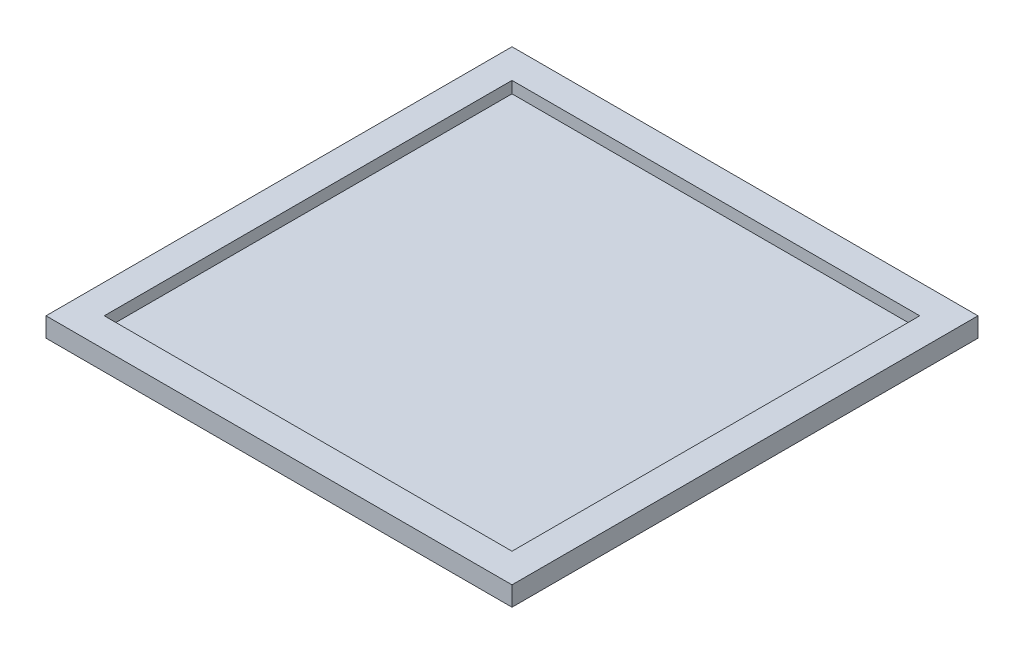
ISO-10303-21;
HEADER;
FILE_DESCRIPTION(('STEP AP214'),'2;1');
FILE_NAME('part.step','',(''),(''),'','','');
FILE_SCHEMA(('AUTOMOTIVE_DESIGN { 1 0 10303 214 1 1 1 1 }'));
ENDSEC;
DATA;
#1=APPLICATION_CONTEXT('core data for automotive mechanical design processes');
#2=APPLICATION_PROTOCOL_DEFINITION('international standard','automotive_design',2000,#1);
#3=PRODUCT_CONTEXT('',#1,'mechanical');
#4=PRODUCT('Part','Part','',(#3));
#5=PRODUCT_RELATED_PRODUCT_CATEGORY('part','',(#4));
#6=PRODUCT_DEFINITION_FORMATION('','',#4);
#7=PRODUCT_DEFINITION_CONTEXT('part definition',#1,'design');
#8=PRODUCT_DEFINITION('design','',#6,#7);
#9=PRODUCT_DEFINITION_SHAPE('','',#8);
#10=(LENGTH_UNIT() NAMED_UNIT(*) SI_UNIT(.MILLI.,.METRE.));
#11=(NAMED_UNIT(*) PLANE_ANGLE_UNIT() SI_UNIT($,.RADIAN.));
#12=(NAMED_UNIT(*) SI_UNIT($,.STERADIAN.) SOLID_ANGLE_UNIT());
#13=UNCERTAINTY_MEASURE_WITH_UNIT(LENGTH_MEASURE(1.E-05),#10,'distance_accuracy_value','');
#14=(GEOMETRIC_REPRESENTATION_CONTEXT(3) GLOBAL_UNCERTAINTY_ASSIGNED_CONTEXT((#13)) GLOBAL_UNIT_ASSIGNED_CONTEXT((#10,
#11,#12)) REPRESENTATION_CONTEXT('',''));
#15=CARTESIAN_POINT('',(0.,0.,0.));
#16=DIRECTION('',(0.,0.,1.));
#17=DIRECTION('',(1.,0.,0.));
#18=AXIS2_PLACEMENT_3D('',#15,#16,#17);
#19=CARTESIAN_POINT('',(60.,5.,60.));
#20=DIRECTION('',(-1.,0.,0.));
#21=DIRECTION('',(0.,0.,1.));
#22=AXIS2_PLACEMENT_3D('',#19,#20,#21);
#23=PLANE('',#22);
#24=DIRECTION('',(0.,0.,-1.));
#25=VECTOR('',#24,1.);
#26=CARTESIAN_POINT('',(60.,0.,60.));
#27=LINE('',#26,#25);
#28=CARTESIAN_POINT('',(60.,0.,60.));
#29=VERTEX_POINT('',#28);
#30=CARTESIAN_POINT('',(60.,0.,-60.));
#31=VERTEX_POINT('',#30);
#32=EDGE_CURVE('E164',#29,#31,#27,.T.);
#33=ORIENTED_EDGE('',*,*,#32,.T.);
#34=DIRECTION('',(0.,-1.,0.));
#35=VECTOR('',#34,1.);
#36=CARTESIAN_POINT('',(60.,5.,-60.));
#37=LINE('',#36,#35);
#38=CARTESIAN_POINT('',(60.,5.,-60.));
#39=VERTEX_POINT('',#38);
#40=EDGE_CURVE('E11',#39,#31,#37,.T.);
#41=ORIENTED_EDGE('',*,*,#40,.F.);
#42=DIRECTION('',(0.,0.,-1.));
#43=VECTOR('',#42,1.);
#44=CARTESIAN_POINT('',(60.,5.,60.));
#45=LINE('',#44,#43);
#46=CARTESIAN_POINT('',(60.,5.,60.));
#47=VERTEX_POINT('',#46);
#48=EDGE_CURVE('E170',#47,#39,#45,.T.);
#49=ORIENTED_EDGE('',*,*,#48,.F.);
#50=DIRECTION('',(0.,-1.,0.));
#51=VECTOR('',#50,1.);
#52=CARTESIAN_POINT('',(60.,5.,60.));
#53=LINE('',#52,#51);
#54=EDGE_CURVE('E180',#47,#29,#53,.T.);
#55=ORIENTED_EDGE('',*,*,#54,.T.);
#56=EDGE_LOOP('',(#33,#41,#49,#55));
#57=FACE_BOUND('',#56,.T.);
#58=ADVANCED_FACE('F45',(#57),#23,.F.);
#59=CARTESIAN_POINT('',(-60.,5.,-60.));
#60=DIRECTION('',(0.,0.,1.));
#61=DIRECTION('',(1.,0.,0.));
#62=AXIS2_PLACEMENT_3D('',#59,#60,#61);
#63=PLANE('',#62);
#64=DIRECTION('',(-1.,0.,0.));
#65=VECTOR('',#64,1.);
#66=CARTESIAN_POINT('',(-60.,0.,-60.));
#67=LINE('',#66,#65);
#68=CARTESIAN_POINT('',(-60.,0.,-60.));
#69=VERTEX_POINT('',#68);
#70=EDGE_CURVE('E184',#31,#69,#67,.T.);
#71=ORIENTED_EDGE('',*,*,#70,.T.);
#72=DIRECTION('',(0.,-1.,0.));
#73=VECTOR('',#72,1.);
#74=CARTESIAN_POINT('',(-60.,5.,-60.));
#75=LINE('',#74,#73);
#76=CARTESIAN_POINT('',(-60.,5.,-60.));
#77=VERTEX_POINT('',#76);
#78=EDGE_CURVE('E53',#77,#69,#75,.T.);
#79=ORIENTED_EDGE('',*,*,#78,.F.);
#80=DIRECTION('',(-1.,0.,0.));
#81=VECTOR('',#80,1.);
#82=CARTESIAN_POINT('',(-60.,5.,-60.));
#83=LINE('',#82,#81);
#84=EDGE_CURVE('E97',#39,#77,#83,.T.);
#85=ORIENTED_EDGE('',*,*,#84,.F.);
#86=ORIENTED_EDGE('',*,*,#40,.T.);
#87=EDGE_LOOP('',(#71,#79,#85,#86));
#88=FACE_BOUND('',#87,.T.);
#89=ADVANCED_FACE('F220',(#88),#63,.F.);
#90=CARTESIAN_POINT('',(-60.,5.,60.));
#91=DIRECTION('',(1.,0.,0.));
#92=DIRECTION('',(0.,0.,-1.));
#93=AXIS2_PLACEMENT_3D('',#90,#91,#92);
#94=PLANE('',#93);
#95=DIRECTION('',(0.,0.,1.));
#96=VECTOR('',#95,1.);
#97=CARTESIAN_POINT('',(-60.,0.,60.));
#98=LINE('',#97,#96);
#99=CARTESIAN_POINT('',(-60.,0.,60.));
#100=VERTEX_POINT('',#99);
#101=EDGE_CURVE('E187',#69,#100,#98,.T.);
#102=ORIENTED_EDGE('',*,*,#101,.T.);
#103=DIRECTION('',(0.,-1.,0.));
#104=VECTOR('',#103,1.);
#105=CARTESIAN_POINT('',(-60.,5.,60.));
#106=LINE('',#105,#104);
#107=CARTESIAN_POINT('',(-60.,5.,60.));
#108=VERTEX_POINT('',#107);
#109=EDGE_CURVE('E194',#108,#100,#106,.T.);
#110=ORIENTED_EDGE('',*,*,#109,.F.);
#111=DIRECTION('',(0.,0.,1.));
#112=VECTOR('',#111,1.);
#113=CARTESIAN_POINT('',(-60.,5.,60.));
#114=LINE('',#113,#112);
#115=EDGE_CURVE('E175',#77,#108,#114,.T.);
#116=ORIENTED_EDGE('',*,*,#115,.F.);
#117=ORIENTED_EDGE('',*,*,#78,.T.);
#118=EDGE_LOOP('',(#102,#110,#116,#117));
#119=FACE_BOUND('',#118,.T.);
#120=ADVANCED_FACE('F201',(#119),#94,.F.);
#121=CARTESIAN_POINT('',(-60.,5.,60.));
#122=DIRECTION('',(0.,0.,-1.));
#123=DIRECTION('',(-1.,0.,0.));
#124=AXIS2_PLACEMENT_3D('',#121,#122,#123);
#125=PLANE('',#124);
#126=DIRECTION('',(1.,0.,0.));
#127=VECTOR('',#126,1.);
#128=CARTESIAN_POINT('',(-60.,0.,60.));
#129=LINE('',#128,#127);
#130=EDGE_CURVE('E90',#100,#29,#129,.T.);
#131=ORIENTED_EDGE('',*,*,#130,.T.);
#132=ORIENTED_EDGE('',*,*,#54,.F.);
#133=DIRECTION('',(1.,0.,0.));
#134=VECTOR('',#133,1.);
#135=CARTESIAN_POINT('',(-60.,5.,60.));
#136=LINE('',#135,#134);
#137=EDGE_CURVE('E69',#108,#47,#136,.T.);
#138=ORIENTED_EDGE('',*,*,#137,.F.);
#139=ORIENTED_EDGE('',*,*,#109,.T.);
#140=EDGE_LOOP('',(#131,#132,#138,#139));
#141=FACE_BOUND('',#140,.T.);
#142=ADVANCED_FACE('F209',(#141),#125,.F.);
#143=CARTESIAN_POINT('',(0.,5.,0.));
#144=DIRECTION('',(0.,-1.,0.));
#145=DIRECTION('',(0.,0.,-1.));
#146=AXIS2_PLACEMENT_3D('',#143,#144,#145);
#147=PLANE('',#146);
#148=DIRECTION('',(-1.,0.,0.));
#149=VECTOR('',#148,1.);
#150=CARTESIAN_POINT('',(-52.5,5.,-52.5));
#151=LINE('',#150,#149);
#152=CARTESIAN_POINT('',(52.5,5.,-52.5));
#153=VERTEX_POINT('',#152);
#154=CARTESIAN_POINT('',(-52.5,5.,-52.5));
#155=VERTEX_POINT('',#154);
#156=EDGE_CURVE('E155',#153,#155,#151,.T.);
#157=ORIENTED_EDGE('',*,*,#156,.F.);
#158=DIRECTION('',(0.,0.,-1.));
#159=VECTOR('',#158,1.);
#160=CARTESIAN_POINT('',(52.5,5.,52.5));
#161=LINE('',#160,#159);
#162=CARTESIAN_POINT('',(52.5,5.,52.5));
#163=VERTEX_POINT('',#162);
#164=EDGE_CURVE('E60',#163,#153,#161,.T.);
#165=ORIENTED_EDGE('',*,*,#164,.F.);
#166=DIRECTION('',(1.,0.,0.));
#167=VECTOR('',#166,1.);
#168=CARTESIAN_POINT('',(-52.5,5.,52.5));
#169=LINE('',#168,#167);
#170=CARTESIAN_POINT('',(-52.5,5.,52.5));
#171=VERTEX_POINT('',#170);
#172=EDGE_CURVE('E142',#171,#163,#169,.T.);
#173=ORIENTED_EDGE('',*,*,#172,.F.);
#174=DIRECTION('',(0.,0.,1.));
#175=VECTOR('',#174,1.);
#176=CARTESIAN_POINT('',(-52.5,5.,52.5));
#177=LINE('',#176,#175);
#178=EDGE_CURVE('E146',#155,#171,#177,.T.);
#179=ORIENTED_EDGE('',*,*,#178,.F.);
#180=EDGE_LOOP('',(#157,#165,#173,#179));
#181=FACE_BOUND('',#180,.T.);
#182=ORIENTED_EDGE('',*,*,#48,.T.);
#183=ORIENTED_EDGE('',*,*,#84,.T.);
#184=ORIENTED_EDGE('',*,*,#115,.T.);
#185=ORIENTED_EDGE('',*,*,#137,.T.);
#186=EDGE_LOOP('',(#182,#183,#184,#185));
#187=FACE_BOUND('',#186,.T.);
#188=ADVANCED_FACE('F211',(#181,#187),#147,.F.);
#189=CARTESIAN_POINT('',(0.,0.,0.));
#190=DIRECTION('',(0.,-1.,0.));
#191=DIRECTION('',(0.,0.,-1.));
#192=AXIS2_PLACEMENT_3D('',#189,#190,#191);
#193=PLANE('',#192);
#194=ORIENTED_EDGE('',*,*,#32,.F.);
#195=ORIENTED_EDGE('',*,*,#130,.F.);
#196=ORIENTED_EDGE('',*,*,#101,.F.);
#197=ORIENTED_EDGE('',*,*,#70,.F.);
#198=EDGE_LOOP('',(#194,#195,#196,#197));
#199=FACE_BOUND('',#198,.T.);
#200=ADVANCED_FACE('F205',(#199),#193,.T.);
#201=CARTESIAN_POINT('',(52.5,2.,52.5));
#202=DIRECTION('',(1.,0.,0.));
#203=DIRECTION('',(0.,0.,-1.));
#204=AXIS2_PLACEMENT_3D('',#201,#202,#203);
#205=PLANE('',#204);
#206=ORIENTED_EDGE('',*,*,#164,.T.);
#207=DIRECTION('',(0.,1.,0.));
#208=VECTOR('',#207,1.);
#209=CARTESIAN_POINT('',(52.5,2.,-52.5));
#210=LINE('',#209,#208);
#211=CARTESIAN_POINT('',(52.5,2.,-52.5));
#212=VERTEX_POINT('',#211);
#213=EDGE_CURVE('E117',#212,#153,#210,.T.);
#214=ORIENTED_EDGE('',*,*,#213,.F.);
#215=DIRECTION('',(0.,0.,-1.));
#216=VECTOR('',#215,1.);
#217=CARTESIAN_POINT('',(52.5,2.,52.5));
#218=LINE('',#217,#216);
#219=CARTESIAN_POINT('',(52.5,2.,52.5));
#220=VERTEX_POINT('',#219);
#221=EDGE_CURVE('E121',#220,#212,#218,.T.);
#222=ORIENTED_EDGE('',*,*,#221,.F.);
#223=DIRECTION('',(0.,1.,0.));
#224=VECTOR('',#223,1.);
#225=CARTESIAN_POINT('',(52.5,2.,52.5));
#226=LINE('',#225,#224);
#227=EDGE_CURVE('E161',#220,#163,#226,.T.);
#228=ORIENTED_EDGE('',*,*,#227,.T.);
#229=EDGE_LOOP('',(#206,#214,#222,#228));
#230=FACE_BOUND('',#229,.T.);
#231=ADVANCED_FACE('F119',(#230),#205,.F.);
#232=CARTESIAN_POINT('',(-52.5,2.,52.5));
#233=DIRECTION('',(0.,0.,1.));
#234=DIRECTION('',(1.,0.,0.));
#235=AXIS2_PLACEMENT_3D('',#232,#233,#234);
#236=PLANE('',#235);
#237=ORIENTED_EDGE('',*,*,#172,.T.);
#238=ORIENTED_EDGE('',*,*,#227,.F.);
#239=DIRECTION('',(1.,0.,0.));
#240=VECTOR('',#239,1.);
#241=CARTESIAN_POINT('',(-52.5,2.,52.5));
#242=LINE('',#241,#240);
#243=CARTESIAN_POINT('',(-52.5,2.,52.5));
#244=VERTEX_POINT('',#243);
#245=EDGE_CURVE('E128',#244,#220,#242,.T.);
#246=ORIENTED_EDGE('',*,*,#245,.F.);
#247=DIRECTION('',(0.,1.,0.));
#248=VECTOR('',#247,1.);
#249=CARTESIAN_POINT('',(-52.5,2.,52.5));
#250=LINE('',#249,#248);
#251=EDGE_CURVE('E165',#244,#171,#250,.T.);
#252=ORIENTED_EDGE('',*,*,#251,.T.);
#253=EDGE_LOOP('',(#237,#238,#246,#252));
#254=FACE_BOUND('',#253,.T.);
#255=ADVANCED_FACE('F260',(#254),#236,.F.);
#256=CARTESIAN_POINT('',(-52.5,2.,52.5));
#257=DIRECTION('',(-1.,0.,0.));
#258=DIRECTION('',(0.,0.,1.));
#259=AXIS2_PLACEMENT_3D('',#256,#257,#258);
#260=PLANE('',#259);
#261=ORIENTED_EDGE('',*,*,#178,.T.);
#262=ORIENTED_EDGE('',*,*,#251,.F.);
#263=DIRECTION('',(0.,0.,1.));
#264=VECTOR('',#263,1.);
#265=CARTESIAN_POINT('',(-52.5,2.,52.5));
#266=LINE('',#265,#264);
#267=CARTESIAN_POINT('',(-52.5,2.,-52.5));
#268=VERTEX_POINT('',#267);
#269=EDGE_CURVE('E137',#268,#244,#266,.T.);
#270=ORIENTED_EDGE('',*,*,#269,.F.);
#271=DIRECTION('',(0.,1.,0.));
#272=VECTOR('',#271,1.);
#273=CARTESIAN_POINT('',(-52.5,2.,-52.5));
#274=LINE('',#273,#272);
#275=EDGE_CURVE('E127',#268,#155,#274,.T.);
#276=ORIENTED_EDGE('',*,*,#275,.T.);
#277=EDGE_LOOP('',(#261,#262,#270,#276));
#278=FACE_BOUND('',#277,.T.);
#279=ADVANCED_FACE('F269',(#278),#260,.F.);
#280=CARTESIAN_POINT('',(-52.5,2.,-52.5));
#281=DIRECTION('',(0.,0.,-1.));
#282=DIRECTION('',(-1.,0.,0.));
#283=AXIS2_PLACEMENT_3D('',#280,#281,#282);
#284=PLANE('',#283);
#285=ORIENTED_EDGE('',*,*,#156,.T.);
#286=ORIENTED_EDGE('',*,*,#275,.F.);
#287=DIRECTION('',(-1.,0.,0.));
#288=VECTOR('',#287,1.);
#289=CARTESIAN_POINT('',(-52.5,2.,-52.5));
#290=LINE('',#289,#288);
#291=EDGE_CURVE('E131',#212,#268,#290,.T.);
#292=ORIENTED_EDGE('',*,*,#291,.F.);
#293=ORIENTED_EDGE('',*,*,#213,.T.);
#294=EDGE_LOOP('',(#285,#286,#292,#293));
#295=FACE_BOUND('',#294,.T.);
#296=ADVANCED_FACE('F132',(#295),#284,.F.);
#297=CARTESIAN_POINT('',(0.,2.,0.));
#298=DIRECTION('',(0.,-1.,0.));
#299=DIRECTION('',(0.,0.,-1.));
#300=AXIS2_PLACEMENT_3D('',#297,#298,#299);
#301=PLANE('',#300);
#302=ORIENTED_EDGE('',*,*,#221,.T.);
#303=ORIENTED_EDGE('',*,*,#291,.T.);
#304=ORIENTED_EDGE('',*,*,#269,.T.);
#305=ORIENTED_EDGE('',*,*,#245,.T.);
#306=EDGE_LOOP('',(#302,#303,#304,#305));
#307=FACE_BOUND('',#306,.T.);
#308=ADVANCED_FACE('F139',(#307),#301,.F.);
#309=CLOSED_SHELL('',(#58,#89,#120,#142,#188,#200,#231,#255,#279,#296,#308));
#310=MANIFOLD_SOLID_BREP('B2',#309);
#311=ADVANCED_BREP_SHAPE_REPRESENTATION('',(#18,#310),#14);
#312=SHAPE_DEFINITION_REPRESENTATION(#9,#311);
ENDSEC;
END-ISO-10303-21;
